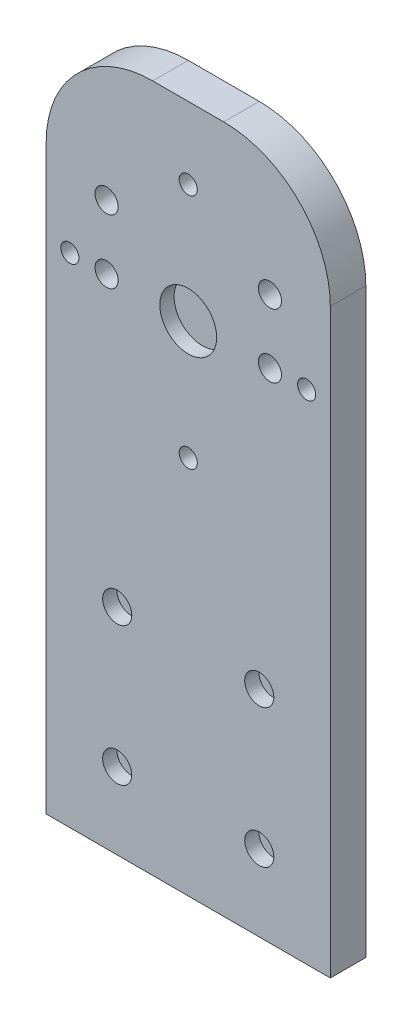
ISO-10303-21;
HEADER;
FILE_DESCRIPTION(('STEP AP214'),'2;1');
FILE_NAME('part.step','',(''),(''),'','','');
FILE_SCHEMA(('AUTOMOTIVE_DESIGN { 1 0 10303 214 1 1 1 1 }'));
ENDSEC;
DATA;
#1=APPLICATION_CONTEXT('core data for automotive mechanical design processes');
#2=APPLICATION_PROTOCOL_DEFINITION('international standard','automotive_design',2000,#1);
#3=PRODUCT_CONTEXT('',#1,'mechanical');
#4=PRODUCT('Part','Part','',(#3));
#5=PRODUCT_RELATED_PRODUCT_CATEGORY('part','',(#4));
#6=PRODUCT_DEFINITION_FORMATION('','',#4);
#7=PRODUCT_DEFINITION_CONTEXT('part definition',#1,'design');
#8=PRODUCT_DEFINITION('design','',#6,#7);
#9=PRODUCT_DEFINITION_SHAPE('','',#8);
#10=(LENGTH_UNIT() NAMED_UNIT(*) SI_UNIT(.MILLI.,.METRE.));
#11=(NAMED_UNIT(*) PLANE_ANGLE_UNIT() SI_UNIT($,.RADIAN.));
#12=(NAMED_UNIT(*) SI_UNIT($,.STERADIAN.) SOLID_ANGLE_UNIT());
#13=UNCERTAINTY_MEASURE_WITH_UNIT(LENGTH_MEASURE(1.E-05),#10,'distance_accuracy_value','');
#14=(GEOMETRIC_REPRESENTATION_CONTEXT(3) GLOBAL_UNCERTAINTY_ASSIGNED_CONTEXT((#13)) GLOBAL_UNIT_ASSIGNED_CONTEXT((#10,
#11,#12)) REPRESENTATION_CONTEXT('',''));
#15=CARTESIAN_POINT('',(0.,0.,0.));
#16=DIRECTION('',(0.,0.,1.));
#17=DIRECTION('',(1.,0.,0.));
#18=AXIS2_PLACEMENT_3D('',#15,#16,#17);
#19=CARTESIAN_POINT('',(1820.42117355047,-1907.58422740443,10.));
#20=DIRECTION('',(-1.,0.,0.));
#21=DIRECTION('',(0.,0.,1.));
#22=AXIS2_PLACEMENT_3D('',#19,#20,#21);
#23=PLANE('',#22);
#24=DIRECTION('',(0.,1.,0.));
#25=VECTOR('',#24,1.);
#26=CARTESIAN_POINT('',(1820.42117355047,-1907.58422740443,0.));
#27=LINE('',#26,#25);
#28=CARTESIAN_POINT('',(1820.42117355047,-1907.58422740443,0.));
#29=VERTEX_POINT('',#28);
#30=CARTESIAN_POINT('',(1820.42117355047,-1743.82818265565,0.));
#31=VERTEX_POINT('',#30);
#32=EDGE_CURVE('E130',#29,#31,#27,.T.);
#33=ORIENTED_EDGE('',*,*,#32,.T.);
#34=DIRECTION('',(0.,0.,-1.));
#35=VECTOR('',#34,1.);
#36=CARTESIAN_POINT('',(1820.42117355047,-1743.82818265565,10.));
#37=LINE('',#36,#35);
#38=CARTESIAN_POINT('',(1820.42117355047,-1743.82818265565,10.));
#39=VERTEX_POINT('',#38);
#40=EDGE_CURVE('E74',#31,#39,#37,.F.);
#41=ORIENTED_EDGE('',*,*,#40,.T.);
#42=DIRECTION('',(0.,1.,0.));
#43=VECTOR('',#42,1.);
#44=CARTESIAN_POINT('',(1820.42117355047,-1907.58422740443,10.));
#45=LINE('',#44,#43);
#46=CARTESIAN_POINT('',(1820.42117355047,-1907.58422740443,10.));
#47=VERTEX_POINT('',#46);
#48=EDGE_CURVE('E138',#47,#39,#45,.T.);
#49=ORIENTED_EDGE('',*,*,#48,.F.);
#50=DIRECTION('',(0.,0.,-1.));
#51=VECTOR('',#50,1.);
#52=CARTESIAN_POINT('',(1820.42117355047,-1907.58422740443,10.));
#53=LINE('',#52,#51);
#54=EDGE_CURVE('E122',#47,#29,#53,.T.);
#55=ORIENTED_EDGE('',*,*,#54,.T.);
#56=EDGE_LOOP('',(#33,#41,#49,#55));
#57=FACE_BOUND('',#56,.T.);
#58=ADVANCED_FACE('F51',(#57),#23,.F.);
#59=CARTESIAN_POINT('',(1820.42117355047,-1713.82818265565,10.));
#60=DIRECTION('',(0.,-1.,0.));
#61=DIRECTION('',(0.,0.,-1.));
#62=AXIS2_PLACEMENT_3D('',#59,#60,#61);
#63=PLANE('',#62);
#64=DIRECTION('',(-1.,0.,0.));
#65=VECTOR('',#64,1.);
#66=CARTESIAN_POINT('',(1820.42117355047,-1713.82818265565,10.));
#67=LINE('',#66,#65);
#68=CARTESIAN_POINT('',(1790.42117355047,-1713.82818265565,10.));
#69=VERTEX_POINT('',#68);
#70=CARTESIAN_POINT('',(1770.4211735505,-1713.82818265565,10.));
#71=VERTEX_POINT('',#70);
#72=EDGE_CURVE('E112',#69,#71,#67,.T.);
#73=ORIENTED_EDGE('',*,*,#72,.F.);
#74=DIRECTION('',(0.,0.,-1.));
#75=VECTOR('',#74,1.);
#76=CARTESIAN_POINT('',(1790.42117355047,-1713.82818265565,10.));
#77=LINE('',#76,#75);
#78=CARTESIAN_POINT('',(1790.42117355047,-1713.82818265565,0.));
#79=VERTEX_POINT('',#78);
#80=EDGE_CURVE('E141',#69,#79,#77,.T.);
#81=ORIENTED_EDGE('',*,*,#80,.T.);
#82=DIRECTION('',(-1.,0.,0.));
#83=VECTOR('',#82,1.);
#84=CARTESIAN_POINT('',(1820.42117355047,-1713.82818265565,0.));
#85=LINE('',#84,#83);
#86=CARTESIAN_POINT('',(1770.4211735505,-1713.82818265565,0.));
#87=VERTEX_POINT('',#86);
#88=EDGE_CURVE('E132',#79,#87,#85,.T.);
#89=ORIENTED_EDGE('',*,*,#88,.T.);
#90=DIRECTION('',(0.,0.,-1.));
#91=VECTOR('',#90,1.);
#92=CARTESIAN_POINT('',(1770.4211735505,-1713.82818265565,10.));
#93=LINE('',#92,#91);
#94=EDGE_CURVE('E121',#87,#71,#93,.F.);
#95=ORIENTED_EDGE('',*,*,#94,.T.);
#96=EDGE_LOOP('',(#73,#81,#89,#95));
#97=FACE_BOUND('',#96,.T.);
#98=ADVANCED_FACE('F154',(#97),#63,.F.);
#99=CARTESIAN_POINT('',(1740.4211735505,-1907.58422740443,10.));
#100=DIRECTION('',(1.,0.,0.));
#101=DIRECTION('',(0.,0.,-1.));
#102=AXIS2_PLACEMENT_3D('',#99,#100,#101);
#103=PLANE('',#102);
#104=DIRECTION('',(0.,-1.,0.));
#105=VECTOR('',#104,1.);
#106=CARTESIAN_POINT('',(1740.4211735505,-1907.58422740443,10.));
#107=LINE('',#106,#105);
#108=CARTESIAN_POINT('',(1740.4211735505,-1743.82818265565,10.));
#109=VERTEX_POINT('',#108);
#110=CARTESIAN_POINT('',(1740.4211735505,-1907.58422740443,10.));
#111=VERTEX_POINT('',#110);
#112=EDGE_CURVE('E104',#109,#111,#107,.T.);
#113=ORIENTED_EDGE('',*,*,#112,.F.);
#114=DIRECTION('',(0.,0.,-1.));
#115=VECTOR('',#114,1.);
#116=CARTESIAN_POINT('',(1740.4211735505,-1743.82818265565,10.));
#117=LINE('',#116,#115);
#118=CARTESIAN_POINT('',(1740.4211735505,-1743.82818265565,0.));
#119=VERTEX_POINT('',#118);
#120=EDGE_CURVE('E12',#109,#119,#117,.T.);
#121=ORIENTED_EDGE('',*,*,#120,.T.);
#122=DIRECTION('',(0.,-1.,0.));
#123=VECTOR('',#122,1.);
#124=CARTESIAN_POINT('',(1740.4211735505,-1907.58422740443,0.));
#125=LINE('',#124,#123);
#126=CARTESIAN_POINT('',(1740.4211735505,-1907.58422740443,0.));
#127=VERTEX_POINT('',#126);
#128=EDGE_CURVE('E118',#119,#127,#125,.T.);
#129=ORIENTED_EDGE('',*,*,#128,.T.);
#130=DIRECTION('',(0.,0.,-1.));
#131=VECTOR('',#130,1.);
#132=CARTESIAN_POINT('',(1740.4211735505,-1907.58422740443,10.));
#133=LINE('',#132,#131);
#134=EDGE_CURVE('E115',#111,#127,#133,.T.);
#135=ORIENTED_EDGE('',*,*,#134,.F.);
#136=EDGE_LOOP('',(#113,#121,#129,#135));
#137=FACE_BOUND('',#136,.T.);
#138=ADVANCED_FACE('F116',(#137),#103,.F.);
#139=CARTESIAN_POINT('',(1820.42117355047,-1907.58422740443,10.));
#140=DIRECTION('',(0.,1.,0.));
#141=DIRECTION('',(0.,0.,1.));
#142=AXIS2_PLACEMENT_3D('',#139,#140,#141);
#143=PLANE('',#142);
#144=DIRECTION('',(1.,0.,0.));
#145=VECTOR('',#144,1.);
#146=CARTESIAN_POINT('',(1820.42117355047,-1907.58422740443,0.));
#147=LINE('',#146,#145);
#148=EDGE_CURVE('E137',#127,#29,#147,.T.);
#149=ORIENTED_EDGE('',*,*,#148,.T.);
#150=ORIENTED_EDGE('',*,*,#54,.F.);
#151=DIRECTION('',(1.,0.,0.));
#152=VECTOR('',#151,1.);
#153=CARTESIAN_POINT('',(1820.42117355047,-1907.58422740443,10.));
#154=LINE('',#153,#152);
#155=EDGE_CURVE('E108',#111,#47,#154,.T.);
#156=ORIENTED_EDGE('',*,*,#155,.F.);
#157=ORIENTED_EDGE('',*,*,#134,.T.);
#158=EDGE_LOOP('',(#149,#150,#156,#157));
#159=FACE_BOUND('',#158,.T.);
#160=ADVANCED_FACE('F124',(#159),#143,.F.);
#161=CARTESIAN_POINT('',(0.,0.,10.));
#162=DIRECTION('',(0.,0.,1.));
#163=DIRECTION('',(1.,0.,0.));
#164=AXIS2_PLACEMENT_3D('',#161,#162,#163);
#165=PLANE('',#164);
#166=CARTESIAN_POINT('',(1780.42117355025,-1767.41940911348,10.));
#167=DIRECTION('',(0.,0.,1.));
#168=DIRECTION('',(1.,0.,0.));
#169=AXIS2_PLACEMENT_3D('',#166,#167,#168);
#170=CIRCLE('',#169,8.0000000002854);
#171=CARTESIAN_POINT('',(1788.42117355054,-1767.41940911348,10.));
#172=VERTEX_POINT('',#171);
#173=EDGE_CURVE('E235',#172,#172,#170,.T.);
#174=ORIENTED_EDGE('',*,*,#173,.F.);
#175=EDGE_LOOP('',(#174));
#176=FACE_BOUND('',#175,.T.);
#177=CARTESIAN_POINT('',(1760.4211735505,-1886.07029953292,10.));
#178=DIRECTION('',(0.,0.,1.));
#179=DIRECTION('',(-1.,0.,0.));
#180=AXIS2_PLACEMENT_3D('',#177,#178,#179);
#181=CIRCLE('',#180,4.09999999999981);
#182=CARTESIAN_POINT('',(1756.3211735505,-1886.07029953292,10.));
#183=VERTEX_POINT('',#182);
#184=EDGE_CURVE('E229',#183,#183,#181,.T.);
#185=ORIENTED_EDGE('',*,*,#184,.F.);
#186=EDGE_LOOP('',(#185));
#187=FACE_BOUND('',#186,.T.);
#188=CARTESIAN_POINT('',(1800.4211735505,-1847.11678492271,10.));
#189=DIRECTION('',(0.,0.,1.));
#190=DIRECTION('',(1.,0.,0.));
#191=AXIS2_PLACEMENT_3D('',#188,#189,#190);
#192=CIRCLE('',#191,4.09999999999889);
#193=CARTESIAN_POINT('',(1804.5211735505,-1847.11678492271,10.));
#194=VERTEX_POINT('',#193);
#195=EDGE_CURVE('E223',#194,#194,#192,.T.);
#196=ORIENTED_EDGE('',*,*,#195,.F.);
#197=EDGE_LOOP('',(#196));
#198=FACE_BOUND('',#197,.T.);
#199=CARTESIAN_POINT('',(1800.4211735505,-1886.07029953292,10.));
#200=DIRECTION('',(0.,0.,1.));
#201=DIRECTION('',(-1.,0.,0.));
#202=AXIS2_PLACEMENT_3D('',#199,#200,#201);
#203=CIRCLE('',#202,4.09999999999889);
#204=CARTESIAN_POINT('',(1796.3211735505,-1886.07029953292,10.));
#205=VERTEX_POINT('',#204);
#206=EDGE_CURVE('E217',#205,#205,#203,.T.);
#207=ORIENTED_EDGE('',*,*,#206,.F.);
#208=EDGE_LOOP('',(#207));
#209=FACE_BOUND('',#208,.T.);
#210=CARTESIAN_POINT('',(1760.4211735505,-1847.11678492271,10.));
#211=DIRECTION('',(0.,0.,1.));
#212=DIRECTION('',(1.,0.,0.));
#213=AXIS2_PLACEMENT_3D('',#210,#211,#212);
#214=CIRCLE('',#213,4.09999999999981);
#215=CARTESIAN_POINT('',(1764.5211735505,-1847.11678492271,10.));
#216=VERTEX_POINT('',#215);
#217=EDGE_CURVE('E211',#216,#216,#214,.T.);
#218=ORIENTED_EDGE('',*,*,#217,.F.);
#219=EDGE_LOOP('',(#218));
#220=FACE_BOUND('',#219,.T.);
#221=CARTESIAN_POINT('',(1757.42117354782,-1767.41940911349,10.));
#222=DIRECTION('',(0.,0.,1.));
#223=DIRECTION('',(1.,0.,0.));
#224=AXIS2_PLACEMENT_3D('',#221,#222,#223);
#225=CIRCLE('',#224,3.25000000001057);
#226=CARTESIAN_POINT('',(1760.67117354783,-1767.41940911349,10.));
#227=VERTEX_POINT('',#226);
#228=EDGE_CURVE('E202',#227,#227,#225,.T.);
#229=ORIENTED_EDGE('',*,*,#228,.F.);
#230=EDGE_LOOP('',(#229));
#231=FACE_BOUND('',#230,.T.);
#232=CARTESIAN_POINT('',(1757.42117354782,-1749.41940911349,10.));
#233=DIRECTION('',(0.,0.,1.));
#234=DIRECTION('',(1.,0.,0.));
#235=AXIS2_PLACEMENT_3D('',#232,#233,#234);
#236=CIRCLE('',#235,3.25000000001057);
#237=CARTESIAN_POINT('',(1760.67117354783,-1749.41940911349,10.));
#238=VERTEX_POINT('',#237);
#239=EDGE_CURVE('E196',#238,#238,#236,.T.);
#240=ORIENTED_EDGE('',*,*,#239,.F.);
#241=EDGE_LOOP('',(#240));
#242=FACE_BOUND('',#241,.T.);
#243=CARTESIAN_POINT('',(1803.42117354782,-1767.41940911349,10.));
#244=DIRECTION('',(0.,0.,1.));
#245=DIRECTION('',(1.,0.,0.));
#246=AXIS2_PLACEMENT_3D('',#243,#244,#245);
#247=CIRCLE('',#246,3.25000000001057);
#248=CARTESIAN_POINT('',(1806.67117354783,-1767.41940911349,10.));
#249=VERTEX_POINT('',#248);
#250=EDGE_CURVE('E190',#249,#249,#247,.T.);
#251=ORIENTED_EDGE('',*,*,#250,.F.);
#252=EDGE_LOOP('',(#251));
#253=FACE_BOUND('',#252,.T.);
#254=CARTESIAN_POINT('',(1803.42117354782,-1749.41940911349,10.));
#255=DIRECTION('',(0.,0.,1.));
#256=DIRECTION('',(1.,0.,0.));
#257=AXIS2_PLACEMENT_3D('',#254,#255,#256);
#258=CIRCLE('',#257,3.25000000001057);
#259=CARTESIAN_POINT('',(1806.67117354783,-1749.41940911349,10.));
#260=VERTEX_POINT('',#259);
#261=EDGE_CURVE('E187',#260,#260,#258,.T.);
#262=ORIENTED_EDGE('',*,*,#261,.F.);
#263=EDGE_LOOP('',(#262));
#264=FACE_BOUND('',#263,.T.);
#265=CARTESIAN_POINT('',(1780.42117355024,-1800.75242277863,10.));
#266=DIRECTION('',(0.,0.,1.));
#267=DIRECTION('',(1.,0.,0.));
#268=AXIS2_PLACEMENT_3D('',#265,#266,#267);
#269=CIRCLE('',#268,2.54999999999979);
#270=CARTESIAN_POINT('',(1782.97117355024,-1800.75242277863,10.));
#271=VERTEX_POINT('',#270);
#272=EDGE_CURVE('E181',#271,#271,#269,.T.);
#273=ORIENTED_EDGE('',*,*,#272,.F.);
#274=EDGE_LOOP('',(#273));
#275=FACE_BOUND('',#274,.T.);
#276=CARTESIAN_POINT('',(1813.75418721537,-1767.41940911349,10.));
#277=DIRECTION('',(0.,0.,1.));
#278=DIRECTION('',(1.,0.,0.));
#279=AXIS2_PLACEMENT_3D('',#276,#277,#278);
#280=CIRCLE('',#279,2.55000000000007);
#281=CARTESIAN_POINT('',(1816.30418721537,-1767.41940911349,10.));
#282=VERTEX_POINT('',#281);
#283=EDGE_CURVE('E175',#282,#282,#280,.T.);
#284=ORIENTED_EDGE('',*,*,#283,.F.);
#285=EDGE_LOOP('',(#284));
#286=FACE_BOUND('',#285,.T.);
#287=CARTESIAN_POINT('',(1780.42117355024,-1734.08639544836,10.));
#288=DIRECTION('',(0.,0.,1.));
#289=DIRECTION('',(1.,0.,0.));
#290=AXIS2_PLACEMENT_3D('',#287,#288,#289);
#291=CIRCLE('',#290,2.55000000000007);
#292=CARTESIAN_POINT('',(1782.97117355024,-1734.08639544836,10.));
#293=VERTEX_POINT('',#292);
#294=EDGE_CURVE('E169',#293,#293,#291,.T.);
#295=ORIENTED_EDGE('',*,*,#294,.F.);
#296=EDGE_LOOP('',(#295));
#297=FACE_BOUND('',#296,.T.);
#298=CARTESIAN_POINT('',(1747.08815988511,-1767.41940911349,10.));
#299=DIRECTION('',(0.,0.,1.));
#300=DIRECTION('',(1.,0.,0.));
#301=AXIS2_PLACEMENT_3D('',#298,#299,#300);
#302=CIRCLE('',#301,2.54999999695057);
#303=CARTESIAN_POINT('',(1749.63815988206,-1767.41940911349,10.));
#304=VERTEX_POINT('',#303);
#305=EDGE_CURVE('E163',#304,#304,#302,.T.);
#306=ORIENTED_EDGE('',*,*,#305,.F.);
#307=EDGE_LOOP('',(#306));
#308=FACE_BOUND('',#307,.T.);
#309=ORIENTED_EDGE('',*,*,#48,.T.);
#310=CARTESIAN_POINT('',(1790.42117355047,-1743.82818265565,10.));
#311=DIRECTION('',(0.,0.,1.));
#312=DIRECTION('',(1.,0.,0.));
#313=AXIS2_PLACEMENT_3D('',#310,#311,#312);
#314=CIRCLE('',#313,30.);
#315=EDGE_CURVE('E59',#39,#69,#314,.T.);
#316=ORIENTED_EDGE('',*,*,#315,.T.);
#317=ORIENTED_EDGE('',*,*,#72,.T.);
#318=CARTESIAN_POINT('',(1770.4211735505,-1743.82818265565,10.));
#319=DIRECTION('',(0.,0.,1.));
#320=DIRECTION('',(1.,0.,0.));
#321=AXIS2_PLACEMENT_3D('',#318,#319,#320);
#322=CIRCLE('',#321,30.);
#323=EDGE_CURVE('E66',#71,#109,#322,.T.);
#324=ORIENTED_EDGE('',*,*,#323,.T.);
#325=ORIENTED_EDGE('',*,*,#112,.T.);
#326=ORIENTED_EDGE('',*,*,#155,.T.);
#327=EDGE_LOOP('',(#309,#316,#317,#324,#325,#326));
#328=FACE_BOUND('',#327,.T.);
#329=ADVANCED_FACE('F106',(#176,#187,#198,#209,#220,#231,#242,#253,#264,#275,#286,#297,#308,
#328),#165,.T.);
#330=CARTESIAN_POINT('',(0.,0.,0.));
#331=DIRECTION('',(0.,0.,1.));
#332=DIRECTION('',(1.,0.,0.));
#333=AXIS2_PLACEMENT_3D('',#330,#331,#332);
#334=PLANE('',#333);
#335=CARTESIAN_POINT('',(1757.42117354782,-1767.41940911349,0.));
#336=DIRECTION('',(0.,0.,1.));
#337=DIRECTION('',(1.,0.,0.));
#338=AXIS2_PLACEMENT_3D('',#335,#336,#337);
#339=CIRCLE('',#338,3.25000000001057);
#340=CARTESIAN_POINT('',(1760.67117354783,-1767.41940911349,0.));
#341=VERTEX_POINT('',#340);
#342=EDGE_CURVE('E205',#341,#341,#339,.T.);
#343=ORIENTED_EDGE('',*,*,#342,.T.);
#344=EDGE_LOOP('',(#343));
#345=FACE_BOUND('',#344,.T.);
#346=CARTESIAN_POINT('',(1757.42117354782,-1749.41940911349,0.));
#347=DIRECTION('',(0.,0.,1.));
#348=DIRECTION('',(1.,0.,0.));
#349=AXIS2_PLACEMENT_3D('',#346,#347,#348);
#350=CIRCLE('',#349,3.25000000001057);
#351=CARTESIAN_POINT('',(1760.67117354783,-1749.41940911349,0.));
#352=VERTEX_POINT('',#351);
#353=EDGE_CURVE('E199',#352,#352,#350,.T.);
#354=ORIENTED_EDGE('',*,*,#353,.T.);
#355=EDGE_LOOP('',(#354));
#356=FACE_BOUND('',#355,.T.);
#357=CARTESIAN_POINT('',(1803.42117354782,-1767.41940911349,0.));
#358=DIRECTION('',(0.,0.,1.));
#359=DIRECTION('',(1.,0.,0.));
#360=AXIS2_PLACEMENT_3D('',#357,#358,#359);
#361=CIRCLE('',#360,3.25000000001057);
#362=CARTESIAN_POINT('',(1806.67117354783,-1767.41940911349,0.));
#363=VERTEX_POINT('',#362);
#364=EDGE_CURVE('E193',#363,#363,#361,.T.);
#365=ORIENTED_EDGE('',*,*,#364,.T.);
#366=EDGE_LOOP('',(#365));
#367=FACE_BOUND('',#366,.T.);
#368=CARTESIAN_POINT('',(1803.42117354782,-1749.41940911349,0.));
#369=DIRECTION('',(0.,0.,1.));
#370=DIRECTION('',(1.,0.,0.));
#371=AXIS2_PLACEMENT_3D('',#368,#369,#370);
#372=CIRCLE('',#371,3.25000000001057);
#373=CARTESIAN_POINT('',(1806.67117354783,-1749.41940911349,0.));
#374=VERTEX_POINT('',#373);
#375=EDGE_CURVE('E184',#374,#374,#372,.T.);
#376=ORIENTED_EDGE('',*,*,#375,.T.);
#377=EDGE_LOOP('',(#376));
#378=FACE_BOUND('',#377,.T.);
#379=CARTESIAN_POINT('',(1780.42117355024,-1800.75242277863,0.));
#380=DIRECTION('',(0.,0.,1.));
#381=DIRECTION('',(1.,0.,0.));
#382=AXIS2_PLACEMENT_3D('',#379,#380,#381);
#383=CIRCLE('',#382,2.54999999999979);
#384=CARTESIAN_POINT('',(1782.97117355024,-1800.75242277863,0.));
#385=VERTEX_POINT('',#384);
#386=EDGE_CURVE('E178',#385,#385,#383,.T.);
#387=ORIENTED_EDGE('',*,*,#386,.T.);
#388=EDGE_LOOP('',(#387));
#389=FACE_BOUND('',#388,.T.);
#390=CARTESIAN_POINT('',(1813.75418721537,-1767.41940911349,0.));
#391=DIRECTION('',(0.,0.,1.));
#392=DIRECTION('',(1.,0.,0.));
#393=AXIS2_PLACEMENT_3D('',#390,#391,#392);
#394=CIRCLE('',#393,2.55000000000007);
#395=CARTESIAN_POINT('',(1816.30418721537,-1767.41940911349,0.));
#396=VERTEX_POINT('',#395);
#397=EDGE_CURVE('E172',#396,#396,#394,.T.);
#398=ORIENTED_EDGE('',*,*,#397,.T.);
#399=EDGE_LOOP('',(#398));
#400=FACE_BOUND('',#399,.T.);
#401=CARTESIAN_POINT('',(1780.42117355024,-1734.08639544836,0.));
#402=DIRECTION('',(0.,0.,1.));
#403=DIRECTION('',(1.,0.,0.));
#404=AXIS2_PLACEMENT_3D('',#401,#402,#403);
#405=CIRCLE('',#404,2.55000000000007);
#406=CARTESIAN_POINT('',(1782.97117355024,-1734.08639544836,0.));
#407=VERTEX_POINT('',#406);
#408=EDGE_CURVE('E166',#407,#407,#405,.T.);
#409=ORIENTED_EDGE('',*,*,#408,.T.);
#410=EDGE_LOOP('',(#409));
#411=FACE_BOUND('',#410,.T.);
#412=CARTESIAN_POINT('',(1747.08815988511,-1767.41940911349,0.));
#413=DIRECTION('',(0.,0.,1.));
#414=DIRECTION('',(1.,0.,0.));
#415=AXIS2_PLACEMENT_3D('',#412,#413,#414);
#416=CIRCLE('',#415,2.54999999695057);
#417=CARTESIAN_POINT('',(1749.63815988206,-1767.41940911349,0.));
#418=VERTEX_POINT('',#417);
#419=EDGE_CURVE('E133',#418,#418,#416,.T.);
#420=ORIENTED_EDGE('',*,*,#419,.T.);
#421=EDGE_LOOP('',(#420));
#422=FACE_BOUND('',#421,.T.);
#423=ORIENTED_EDGE('',*,*,#88,.F.);
#424=CARTESIAN_POINT('',(1790.42117355047,-1743.82818265565,0.));
#425=DIRECTION('',(0.,0.,1.));
#426=DIRECTION('',(1.,0.,0.));
#427=AXIS2_PLACEMENT_3D('',#424,#425,#426);
#428=CIRCLE('',#427,30.);
#429=EDGE_CURVE('E146',#79,#31,#428,.F.);
#430=ORIENTED_EDGE('',*,*,#429,.T.);
#431=ORIENTED_EDGE('',*,*,#32,.F.);
#432=ORIENTED_EDGE('',*,*,#148,.F.);
#433=ORIENTED_EDGE('',*,*,#128,.F.);
#434=CARTESIAN_POINT('',(1770.4211735505,-1743.82818265565,0.));
#435=DIRECTION('',(0.,0.,1.));
#436=DIRECTION('',(1.,0.,0.));
#437=AXIS2_PLACEMENT_3D('',#434,#435,#436);
#438=CIRCLE('',#437,30.);
#439=EDGE_CURVE('E144',#119,#87,#438,.F.);
#440=ORIENTED_EDGE('',*,*,#439,.T.);
#441=EDGE_LOOP('',(#423,#430,#431,#432,#433,#440));
#442=FACE_BOUND('',#441,.T.);
#443=ADVANCED_FACE('F160',(#345,#356,#367,#378,#389,#400,#411,#422,#442),#334,.F.);
#444=CARTESIAN_POINT('',(1747.08815988511,-1767.41940911349,0.));
#445=DIRECTION('',(0.,0.,1.));
#446=DIRECTION('',(1.,0.,0.));
#447=AXIS2_PLACEMENT_3D('',#444,#445,#446);
#448=CYLINDRICAL_SURFACE('',#447,2.54999999695057);
#449=ORIENTED_EDGE('',*,*,#419,.F.);
#450=EDGE_LOOP('',(#449));
#451=FACE_BOUND('',#450,.T.);
#452=ORIENTED_EDGE('',*,*,#305,.T.);
#453=EDGE_LOOP('',(#452));
#454=FACE_BOUND('',#453,.T.);
#455=ADVANCED_FACE('F276',(#451,#454),#448,.F.);
#456=CARTESIAN_POINT('',(1780.42117355024,-1734.08639544836,0.));
#457=DIRECTION('',(0.,0.,1.));
#458=DIRECTION('',(1.,0.,0.));
#459=AXIS2_PLACEMENT_3D('',#456,#457,#458);
#460=CYLINDRICAL_SURFACE('',#459,2.55000000000007);
#461=ORIENTED_EDGE('',*,*,#408,.F.);
#462=EDGE_LOOP('',(#461));
#463=FACE_BOUND('',#462,.T.);
#464=ORIENTED_EDGE('',*,*,#294,.T.);
#465=EDGE_LOOP('',(#464));
#466=FACE_BOUND('',#465,.T.);
#467=ADVANCED_FACE('F278',(#463,#466),#460,.F.);
#468=CARTESIAN_POINT('',(1813.75418721537,-1767.41940911349,0.));
#469=DIRECTION('',(0.,0.,1.));
#470=DIRECTION('',(1.,0.,0.));
#471=AXIS2_PLACEMENT_3D('',#468,#469,#470);
#472=CYLINDRICAL_SURFACE('',#471,2.55000000000007);
#473=ORIENTED_EDGE('',*,*,#397,.F.);
#474=EDGE_LOOP('',(#473));
#475=FACE_BOUND('',#474,.T.);
#476=ORIENTED_EDGE('',*,*,#283,.T.);
#477=EDGE_LOOP('',(#476));
#478=FACE_BOUND('',#477,.T.);
#479=ADVANCED_FACE('F285',(#475,#478),#472,.F.);
#480=CARTESIAN_POINT('',(1780.42117355024,-1800.75242277863,0.));
#481=DIRECTION('',(0.,0.,1.));
#482=DIRECTION('',(1.,0.,0.));
#483=AXIS2_PLACEMENT_3D('',#480,#481,#482);
#484=CYLINDRICAL_SURFACE('',#483,2.54999999999979);
#485=ORIENTED_EDGE('',*,*,#386,.F.);
#486=EDGE_LOOP('',(#485));
#487=FACE_BOUND('',#486,.T.);
#488=ORIENTED_EDGE('',*,*,#272,.T.);
#489=EDGE_LOOP('',(#488));
#490=FACE_BOUND('',#489,.T.);
#491=ADVANCED_FACE('F354',(#487,#490),#484,.F.);
#492=CARTESIAN_POINT('',(1803.42117354782,-1749.41940911349,0.));
#493=DIRECTION('',(0.,0.,1.));
#494=DIRECTION('',(1.,0.,0.));
#495=AXIS2_PLACEMENT_3D('',#492,#493,#494);
#496=CYLINDRICAL_SURFACE('',#495,3.25000000001057);
#497=ORIENTED_EDGE('',*,*,#375,.F.);
#498=EDGE_LOOP('',(#497));
#499=FACE_BOUND('',#498,.T.);
#500=ORIENTED_EDGE('',*,*,#261,.T.);
#501=EDGE_LOOP('',(#500));
#502=FACE_BOUND('',#501,.T.);
#503=ADVANCED_FACE('F350',(#499,#502),#496,.F.);
#504=CARTESIAN_POINT('',(1803.42117354782,-1767.41940911349,0.));
#505=DIRECTION('',(0.,0.,1.));
#506=DIRECTION('',(1.,0.,0.));
#507=AXIS2_PLACEMENT_3D('',#504,#505,#506);
#508=CYLINDRICAL_SURFACE('',#507,3.25000000001057);
#509=ORIENTED_EDGE('',*,*,#364,.F.);
#510=EDGE_LOOP('',(#509));
#511=FACE_BOUND('',#510,.T.);
#512=ORIENTED_EDGE('',*,*,#250,.T.);
#513=EDGE_LOOP('',(#512));
#514=FACE_BOUND('',#513,.T.);
#515=ADVANCED_FACE('F346',(#511,#514),#508,.F.);
#516=CARTESIAN_POINT('',(1757.42117354782,-1749.41940911349,0.));
#517=DIRECTION('',(0.,0.,1.));
#518=DIRECTION('',(1.,0.,0.));
#519=AXIS2_PLACEMENT_3D('',#516,#517,#518);
#520=CYLINDRICAL_SURFACE('',#519,3.25000000001057);
#521=ORIENTED_EDGE('',*,*,#353,.F.);
#522=EDGE_LOOP('',(#521));
#523=FACE_BOUND('',#522,.T.);
#524=ORIENTED_EDGE('',*,*,#239,.T.);
#525=EDGE_LOOP('',(#524));
#526=FACE_BOUND('',#525,.T.);
#527=ADVANCED_FACE('F342',(#523,#526),#520,.F.);
#528=CARTESIAN_POINT('',(1757.42117354782,-1767.41940911349,0.));
#529=DIRECTION('',(0.,0.,1.));
#530=DIRECTION('',(1.,0.,0.));
#531=AXIS2_PLACEMENT_3D('',#528,#529,#530);
#532=CYLINDRICAL_SURFACE('',#531,3.25000000001057);
#533=ORIENTED_EDGE('',*,*,#342,.F.);
#534=EDGE_LOOP('',(#533));
#535=FACE_BOUND('',#534,.T.);
#536=ORIENTED_EDGE('',*,*,#228,.T.);
#537=EDGE_LOOP('',(#536));
#538=FACE_BOUND('',#537,.T.);
#539=ADVANCED_FACE('F338',(#535,#538),#532,.F.);
#540=CARTESIAN_POINT('',(1760.4211735505,-1847.11678492271,6.));
#541=DIRECTION('',(0.,0.,1.));
#542=DIRECTION('',(1.,0.,0.));
#543=AXIS2_PLACEMENT_3D('',#540,#541,#542);
#544=CYLINDRICAL_SURFACE('',#543,4.09999999999981);
#545=CARTESIAN_POINT('',(1760.4211735505,-1847.11678492271,6.));
#546=DIRECTION('',(0.,0.,1.));
#547=DIRECTION('',(1.,0.,0.));
#548=AXIS2_PLACEMENT_3D('',#545,#546,#547);
#549=CIRCLE('',#548,4.09999999999981);
#550=CARTESIAN_POINT('',(1764.5211735505,-1847.11678492271,6.));
#551=VERTEX_POINT('',#550);
#552=EDGE_CURVE('E208',#551,#551,#549,.T.);
#553=ORIENTED_EDGE('',*,*,#552,.F.);
#554=EDGE_LOOP('',(#553));
#555=FACE_BOUND('',#554,.T.);
#556=ORIENTED_EDGE('',*,*,#217,.T.);
#557=EDGE_LOOP('',(#556));
#558=FACE_BOUND('',#557,.T.);
#559=ADVANCED_FACE('F334',(#555,#558),#544,.F.);
#560=CARTESIAN_POINT('',(1760.4211735505,-1847.11678492271,6.));
#561=DIRECTION('',(0.,0.,1.));
#562=DIRECTION('',(1.,0.,0.));
#563=AXIS2_PLACEMENT_3D('',#560,#561,#562);
#564=PLANE('',#563);
#565=ORIENTED_EDGE('',*,*,#552,.T.);
#566=EDGE_LOOP('',(#565));
#567=FACE_BOUND('',#566,.T.);
#568=ADVANCED_FACE('F330',(#567),#564,.T.);
#569=CARTESIAN_POINT('',(1800.4211735505,-1886.07029953292,6.));
#570=DIRECTION('',(0.,0.,1.));
#571=DIRECTION('',(1.,0.,0.));
#572=AXIS2_PLACEMENT_3D('',#569,#570,#571);
#573=CYLINDRICAL_SURFACE('',#572,4.09999999999889);
#574=CARTESIAN_POINT('',(1800.4211735505,-1886.07029953292,6.));
#575=DIRECTION('',(0.,0.,1.));
#576=DIRECTION('',(-1.,0.,0.));
#577=AXIS2_PLACEMENT_3D('',#574,#575,#576);
#578=CIRCLE('',#577,4.09999999999889);
#579=CARTESIAN_POINT('',(1796.3211735505,-1886.07029953292,6.));
#580=VERTEX_POINT('',#579);
#581=EDGE_CURVE('E214',#580,#580,#578,.T.);
#582=ORIENTED_EDGE('',*,*,#581,.F.);
#583=EDGE_LOOP('',(#582));
#584=FACE_BOUND('',#583,.T.);
#585=ORIENTED_EDGE('',*,*,#206,.T.);
#586=EDGE_LOOP('',(#585));
#587=FACE_BOUND('',#586,.T.);
#588=ADVANCED_FACE('F326',(#584,#587),#573,.F.);
#589=CARTESIAN_POINT('',(1800.4211735505,-1886.07029953292,6.));
#590=DIRECTION('',(0.,0.,-1.));
#591=DIRECTION('',(-1.,0.,0.));
#592=AXIS2_PLACEMENT_3D('',#589,#590,#591);
#593=PLANE('',#592);
#594=ORIENTED_EDGE('',*,*,#581,.T.);
#595=EDGE_LOOP('',(#594));
#596=FACE_BOUND('',#595,.T.);
#597=ADVANCED_FACE('F322',(#596),#593,.F.);
#598=CARTESIAN_POINT('',(1800.4211735505,-1847.11678492271,6.));
#599=DIRECTION('',(0.,0.,1.));
#600=DIRECTION('',(1.,0.,0.));
#601=AXIS2_PLACEMENT_3D('',#598,#599,#600);
#602=CYLINDRICAL_SURFACE('',#601,4.09999999999889);
#603=CARTESIAN_POINT('',(1800.4211735505,-1847.11678492271,6.));
#604=DIRECTION('',(0.,0.,1.));
#605=DIRECTION('',(1.,0.,0.));
#606=AXIS2_PLACEMENT_3D('',#603,#604,#605);
#607=CIRCLE('',#606,4.09999999999889);
#608=CARTESIAN_POINT('',(1804.5211735505,-1847.11678492271,6.));
#609=VERTEX_POINT('',#608);
#610=EDGE_CURVE('E220',#609,#609,#607,.T.);
#611=ORIENTED_EDGE('',*,*,#610,.F.);
#612=EDGE_LOOP('',(#611));
#613=FACE_BOUND('',#612,.T.);
#614=ORIENTED_EDGE('',*,*,#195,.T.);
#615=EDGE_LOOP('',(#614));
#616=FACE_BOUND('',#615,.T.);
#617=ADVANCED_FACE('F318',(#613,#616),#602,.F.);
#618=CARTESIAN_POINT('',(1800.4211735505,-1847.11678492271,6.));
#619=DIRECTION('',(0.,0.,1.));
#620=DIRECTION('',(1.,0.,0.));
#621=AXIS2_PLACEMENT_3D('',#618,#619,#620);
#622=PLANE('',#621);
#623=ORIENTED_EDGE('',*,*,#610,.T.);
#624=EDGE_LOOP('',(#623));
#625=FACE_BOUND('',#624,.T.);
#626=ADVANCED_FACE('F311',(#625),#622,.T.);
#627=CARTESIAN_POINT('',(1760.4211735505,-1886.07029953292,6.));
#628=DIRECTION('',(0.,0.,1.));
#629=DIRECTION('',(1.,0.,0.));
#630=AXIS2_PLACEMENT_3D('',#627,#628,#629);
#631=CYLINDRICAL_SURFACE('',#630,4.09999999999981);
#632=CARTESIAN_POINT('',(1760.4211735505,-1886.07029953292,6.));
#633=DIRECTION('',(0.,0.,1.));
#634=DIRECTION('',(-1.,0.,0.));
#635=AXIS2_PLACEMENT_3D('',#632,#633,#634);
#636=CIRCLE('',#635,4.09999999999981);
#637=CARTESIAN_POINT('',(1756.3211735505,-1886.07029953292,6.));
#638=VERTEX_POINT('',#637);
#639=EDGE_CURVE('E226',#638,#638,#636,.T.);
#640=ORIENTED_EDGE('',*,*,#639,.F.);
#641=EDGE_LOOP('',(#640));
#642=FACE_BOUND('',#641,.T.);
#643=ORIENTED_EDGE('',*,*,#184,.T.);
#644=EDGE_LOOP('',(#643));
#645=FACE_BOUND('',#644,.T.);
#646=ADVANCED_FACE('F305',(#642,#645),#631,.F.);
#647=CARTESIAN_POINT('',(1760.4211735505,-1886.07029953292,6.));
#648=DIRECTION('',(0.,0.,-1.));
#649=DIRECTION('',(-1.,0.,0.));
#650=AXIS2_PLACEMENT_3D('',#647,#648,#649);
#651=PLANE('',#650);
#652=ORIENTED_EDGE('',*,*,#639,.T.);
#653=EDGE_LOOP('',(#652));
#654=FACE_BOUND('',#653,.T.);
#655=ADVANCED_FACE('F299',(#654),#651,.F.);
#656=CARTESIAN_POINT('',(1790.42117355047,-1743.82818265565,10.));
#657=DIRECTION('',(0.,0.,-1.));
#658=DIRECTION('',(-1.,0.,0.));
#659=AXIS2_PLACEMENT_3D('',#656,#657,#658);
#660=CYLINDRICAL_SURFACE('',#659,30.);
#661=ORIENTED_EDGE('',*,*,#315,.F.);
#662=ORIENTED_EDGE('',*,*,#40,.F.);
#663=ORIENTED_EDGE('',*,*,#429,.F.);
#664=ORIENTED_EDGE('',*,*,#80,.F.);
#665=EDGE_LOOP('',(#661,#662,#663,#664));
#666=FACE_BOUND('',#665,.T.);
#667=ADVANCED_FACE('F157',(#666),#660,.T.);
#668=CARTESIAN_POINT('',(1770.4211735505,-1743.82818265565,10.));
#669=DIRECTION('',(0.,0.,-1.));
#670=DIRECTION('',(-1.,0.,0.));
#671=AXIS2_PLACEMENT_3D('',#668,#669,#670);
#672=CYLINDRICAL_SURFACE('',#671,30.);
#673=ORIENTED_EDGE('',*,*,#323,.F.);
#674=ORIENTED_EDGE('',*,*,#94,.F.);
#675=ORIENTED_EDGE('',*,*,#439,.F.);
#676=ORIENTED_EDGE('',*,*,#120,.F.);
#677=EDGE_LOOP('',(#673,#674,#675,#676));
#678=FACE_BOUND('',#677,.T.);
#679=ADVANCED_FACE('F53',(#678),#672,.T.);
#680=CARTESIAN_POINT('',(1780.42117355025,-1767.41940911348,6.));
#681=DIRECTION('',(0.,0.,1.));
#682=DIRECTION('',(1.,0.,0.));
#683=AXIS2_PLACEMENT_3D('',#680,#681,#682);
#684=CYLINDRICAL_SURFACE('',#683,8.0000000002854);
#685=CARTESIAN_POINT('',(1780.42117355025,-1767.41940911348,6.));
#686=DIRECTION('',(0.,0.,1.));
#687=DIRECTION('',(1.,0.,0.));
#688=AXIS2_PLACEMENT_3D('',#685,#686,#687);
#689=CIRCLE('',#688,8.0000000002854);
#690=CARTESIAN_POINT('',(1788.42117355054,-1767.41940911348,6.));
#691=VERTEX_POINT('',#690);
#692=EDGE_CURVE('E232',#691,#691,#689,.T.);
#693=ORIENTED_EDGE('',*,*,#692,.F.);
#694=EDGE_LOOP('',(#693));
#695=FACE_BOUND('',#694,.T.);
#696=ORIENTED_EDGE('',*,*,#173,.T.);
#697=EDGE_LOOP('',(#696));
#698=FACE_BOUND('',#697,.T.);
#699=ADVANCED_FACE('F243',(#695,#698),#684,.F.);
#700=CARTESIAN_POINT('',(1780.42117355025,-1767.41940911348,6.));
#701=DIRECTION('',(0.,0.,1.));
#702=DIRECTION('',(1.,0.,0.));
#703=AXIS2_PLACEMENT_3D('',#700,#701,#702);
#704=PLANE('',#703);
#705=ORIENTED_EDGE('',*,*,#692,.T.);
#706=EDGE_LOOP('',(#705));
#707=FACE_BOUND('',#706,.T.);
#708=ADVANCED_FACE('F241',(#707),#704,.T.);
#709=CLOSED_SHELL('',(#58,#98,#138,#160,#329,#443,#455,#467,#479,#491,#503,#515,#527,#539,#559,
#568,#588,#597,#617,#626,#646,#655,#667,#679,#699,#708));
#710=MANIFOLD_SOLID_BREP('B2',#709);
#711=ADVANCED_BREP_SHAPE_REPRESENTATION('',(#18,#710),#14);
#712=SHAPE_DEFINITION_REPRESENTATION(#9,#711);
ENDSEC;
END-ISO-10303-21;
